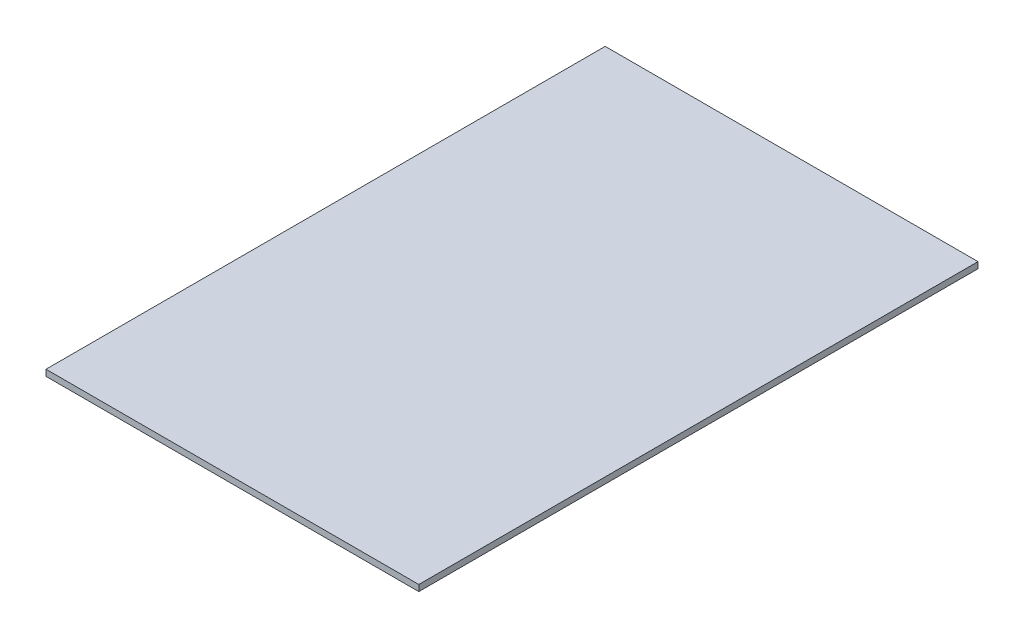
ISO-10303-21;
HEADER;
FILE_DESCRIPTION(('STEP AP214'),'2;1');
FILE_NAME('part.step','',(''),(''),'','','');
FILE_SCHEMA(('AUTOMOTIVE_DESIGN { 1 0 10303 214 1 1 1 1 }'));
ENDSEC;
DATA;
#1=APPLICATION_CONTEXT('core data for automotive mechanical design processes');
#2=APPLICATION_PROTOCOL_DEFINITION('international standard','automotive_design',2000,#1);
#3=PRODUCT_CONTEXT('',#1,'mechanical');
#4=PRODUCT('Part','Part','',(#3));
#5=PRODUCT_RELATED_PRODUCT_CATEGORY('part','',(#4));
#6=PRODUCT_DEFINITION_FORMATION('','',#4);
#7=PRODUCT_DEFINITION_CONTEXT('part definition',#1,'design');
#8=PRODUCT_DEFINITION('design','',#6,#7);
#9=PRODUCT_DEFINITION_SHAPE('','',#8);
#10=(LENGTH_UNIT() NAMED_UNIT(*) SI_UNIT(.MILLI.,.METRE.));
#11=(NAMED_UNIT(*) PLANE_ANGLE_UNIT() SI_UNIT($,.RADIAN.));
#12=(NAMED_UNIT(*) SI_UNIT($,.STERADIAN.) SOLID_ANGLE_UNIT());
#13=UNCERTAINTY_MEASURE_WITH_UNIT(LENGTH_MEASURE(1.E-05),#10,'distance_accuracy_value','');
#14=(GEOMETRIC_REPRESENTATION_CONTEXT(3) GLOBAL_UNCERTAINTY_ASSIGNED_CONTEXT((#13)) GLOBAL_UNIT_ASSIGNED_CONTEXT((#10,
#11,#12)) REPRESENTATION_CONTEXT('',''));
#15=CARTESIAN_POINT('',(0.,0.,0.));
#16=DIRECTION('',(0.,0.,1.));
#17=DIRECTION('',(1.,0.,0.));
#18=AXIS2_PLACEMENT_3D('',#15,#16,#17);
#19=CARTESIAN_POINT('',(-60.,2.,-90.));
#20=DIRECTION('',(0.,0.,-1.));
#21=DIRECTION('',(-1.,0.,0.));
#22=AXIS2_PLACEMENT_3D('',#19,#20,#21);
#23=PLANE('',#22);
#24=DIRECTION('',(1.,0.,0.));
#25=VECTOR('',#24,1.);
#26=CARTESIAN_POINT('',(-60.,0.,-90.));
#27=LINE('',#26,#25);
#28=CARTESIAN_POINT('',(-60.,0.,-90.));
#29=VERTEX_POINT('',#28);
#30=CARTESIAN_POINT('',(60.,0.,-90.));
#31=VERTEX_POINT('',#30);
#32=EDGE_CURVE('E97',#29,#31,#27,.T.);
#33=ORIENTED_EDGE('',*,*,#32,.F.);
#34=DIRECTION('',(0.,-1.,0.));
#35=VECTOR('',#34,1.);
#36=CARTESIAN_POINT('',(-60.,2.,-90.));
#37=LINE('',#36,#35);
#38=CARTESIAN_POINT('',(-60.,2.,-90.));
#39=VERTEX_POINT('',#38);
#40=EDGE_CURVE('E11',#39,#29,#37,.T.);
#41=ORIENTED_EDGE('',*,*,#40,.F.);
#42=DIRECTION('',(1.,0.,0.));
#43=VECTOR('',#42,1.);
#44=CARTESIAN_POINT('',(-60.,2.,-90.));
#45=LINE('',#44,#43);
#46=CARTESIAN_POINT('',(60.,2.,-90.));
#47=VERTEX_POINT('',#46);
#48=EDGE_CURVE('E92',#39,#47,#45,.T.);
#49=ORIENTED_EDGE('',*,*,#48,.T.);
#50=DIRECTION('',(0.,-1.,0.));
#51=VECTOR('',#50,1.);
#52=CARTESIAN_POINT('',(60.,2.,-90.));
#53=LINE('',#52,#51);
#54=EDGE_CURVE('E35',#47,#31,#53,.T.);
#55=ORIENTED_EDGE('',*,*,#54,.T.);
#56=EDGE_LOOP('',(#33,#41,#49,#55));
#57=FACE_BOUND('',#56,.T.);
#58=ADVANCED_FACE('F32',(#57),#23,.T.);
#59=CARTESIAN_POINT('',(-60.,2.,-90.));
#60=DIRECTION('',(1.,0.,0.));
#61=DIRECTION('',(0.,0.,-1.));
#62=AXIS2_PLACEMENT_3D('',#59,#60,#61);
#63=PLANE('',#62);
#64=DIRECTION('',(0.,0.,1.));
#65=VECTOR('',#64,1.);
#66=CARTESIAN_POINT('',(-60.,0.,-90.));
#67=LINE('',#66,#65);
#68=CARTESIAN_POINT('',(-60.,0.,90.));
#69=VERTEX_POINT('',#68);
#70=EDGE_CURVE('E65',#29,#69,#67,.T.);
#71=ORIENTED_EDGE('',*,*,#70,.T.);
#72=DIRECTION('',(0.,-1.,0.));
#73=VECTOR('',#72,1.);
#74=CARTESIAN_POINT('',(-60.,2.,90.));
#75=LINE('',#74,#73);
#76=CARTESIAN_POINT('',(-60.,2.,90.));
#77=VERTEX_POINT('',#76);
#78=EDGE_CURVE('E41',#77,#69,#75,.T.);
#79=ORIENTED_EDGE('',*,*,#78,.F.);
#80=DIRECTION('',(0.,0.,1.));
#81=VECTOR('',#80,1.);
#82=CARTESIAN_POINT('',(-60.,2.,-90.));
#83=LINE('',#82,#81);
#84=EDGE_CURVE('E82',#39,#77,#83,.T.);
#85=ORIENTED_EDGE('',*,*,#84,.F.);
#86=ORIENTED_EDGE('',*,*,#40,.T.);
#87=EDGE_LOOP('',(#71,#79,#85,#86));
#88=FACE_BOUND('',#87,.T.);
#89=ADVANCED_FACE('F107',(#88),#63,.F.);
#90=CARTESIAN_POINT('',(-60.,2.,90.));
#91=DIRECTION('',(0.,0.,-1.));
#92=DIRECTION('',(-1.,0.,0.));
#93=AXIS2_PLACEMENT_3D('',#90,#91,#92);
#94=PLANE('',#93);
#95=DIRECTION('',(1.,0.,0.));
#96=VECTOR('',#95,1.);
#97=CARTESIAN_POINT('',(-60.,0.,90.));
#98=LINE('',#97,#96);
#99=CARTESIAN_POINT('',(60.,0.,90.));
#100=VERTEX_POINT('',#99);
#101=EDGE_CURVE('E89',#69,#100,#98,.T.);
#102=ORIENTED_EDGE('',*,*,#101,.T.);
#103=DIRECTION('',(0.,-1.,0.));
#104=VECTOR('',#103,1.);
#105=CARTESIAN_POINT('',(60.,2.,90.));
#106=LINE('',#105,#104);
#107=CARTESIAN_POINT('',(60.,2.,90.));
#108=VERTEX_POINT('',#107);
#109=EDGE_CURVE('E86',#108,#100,#106,.T.);
#110=ORIENTED_EDGE('',*,*,#109,.F.);
#111=DIRECTION('',(1.,0.,0.));
#112=VECTOR('',#111,1.);
#113=CARTESIAN_POINT('',(-60.,2.,90.));
#114=LINE('',#113,#112);
#115=EDGE_CURVE('E77',#77,#108,#114,.T.);
#116=ORIENTED_EDGE('',*,*,#115,.F.);
#117=ORIENTED_EDGE('',*,*,#78,.T.);
#118=EDGE_LOOP('',(#102,#110,#116,#117));
#119=FACE_BOUND('',#118,.T.);
#120=ADVANCED_FACE('F87',(#119),#94,.F.);
#121=CARTESIAN_POINT('',(60.,2.,-90.));
#122=DIRECTION('',(1.,0.,0.));
#123=DIRECTION('',(0.,0.,-1.));
#124=AXIS2_PLACEMENT_3D('',#121,#122,#123);
#125=PLANE('',#124);
#126=DIRECTION('',(0.,0.,1.));
#127=VECTOR('',#126,1.);
#128=CARTESIAN_POINT('',(60.,0.,-90.));
#129=LINE('',#128,#127);
#130=EDGE_CURVE('E100',#31,#100,#129,.T.);
#131=ORIENTED_EDGE('',*,*,#130,.F.);
#132=ORIENTED_EDGE('',*,*,#54,.F.);
#133=DIRECTION('',(0.,0.,1.));
#134=VECTOR('',#133,1.);
#135=CARTESIAN_POINT('',(60.,2.,-90.));
#136=LINE('',#135,#134);
#137=EDGE_CURVE('E81',#47,#108,#136,.T.);
#138=ORIENTED_EDGE('',*,*,#137,.T.);
#139=ORIENTED_EDGE('',*,*,#109,.T.);
#140=EDGE_LOOP('',(#131,#132,#138,#139));
#141=FACE_BOUND('',#140,.T.);
#142=ADVANCED_FACE('F91',(#141),#125,.T.);
#143=CARTESIAN_POINT('',(0.,2.,0.));
#144=DIRECTION('',(0.,-1.,0.));
#145=DIRECTION('',(0.,0.,-1.));
#146=AXIS2_PLACEMENT_3D('',#143,#144,#145);
#147=PLANE('',#146);
#148=ORIENTED_EDGE('',*,*,#48,.F.);
#149=ORIENTED_EDGE('',*,*,#84,.T.);
#150=ORIENTED_EDGE('',*,*,#115,.T.);
#151=ORIENTED_EDGE('',*,*,#137,.F.);
#152=EDGE_LOOP('',(#148,#149,#150,#151));
#153=FACE_BOUND('',#152,.T.);
#154=ADVANCED_FACE('F80',(#153),#147,.F.);
#155=CARTESIAN_POINT('',(0.,0.,0.));
#156=DIRECTION('',(0.,-1.,0.));
#157=DIRECTION('',(0.,0.,-1.));
#158=AXIS2_PLACEMENT_3D('',#155,#156,#157);
#159=PLANE('',#158);
#160=ORIENTED_EDGE('',*,*,#32,.T.);
#161=ORIENTED_EDGE('',*,*,#130,.T.);
#162=ORIENTED_EDGE('',*,*,#101,.F.);
#163=ORIENTED_EDGE('',*,*,#70,.F.);
#164=EDGE_LOOP('',(#160,#161,#162,#163));
#165=FACE_BOUND('',#164,.T.);
#166=ADVANCED_FACE('F105',(#165),#159,.T.);
#167=CLOSED_SHELL('',(#58,#89,#120,#142,#154,#166));
#168=MANIFOLD_SOLID_BREP('B2',#167);
#169=ADVANCED_BREP_SHAPE_REPRESENTATION('',(#18,#168),#14);
#170=SHAPE_DEFINITION_REPRESENTATION(#9,#169);
ENDSEC;
END-ISO-10303-21;
